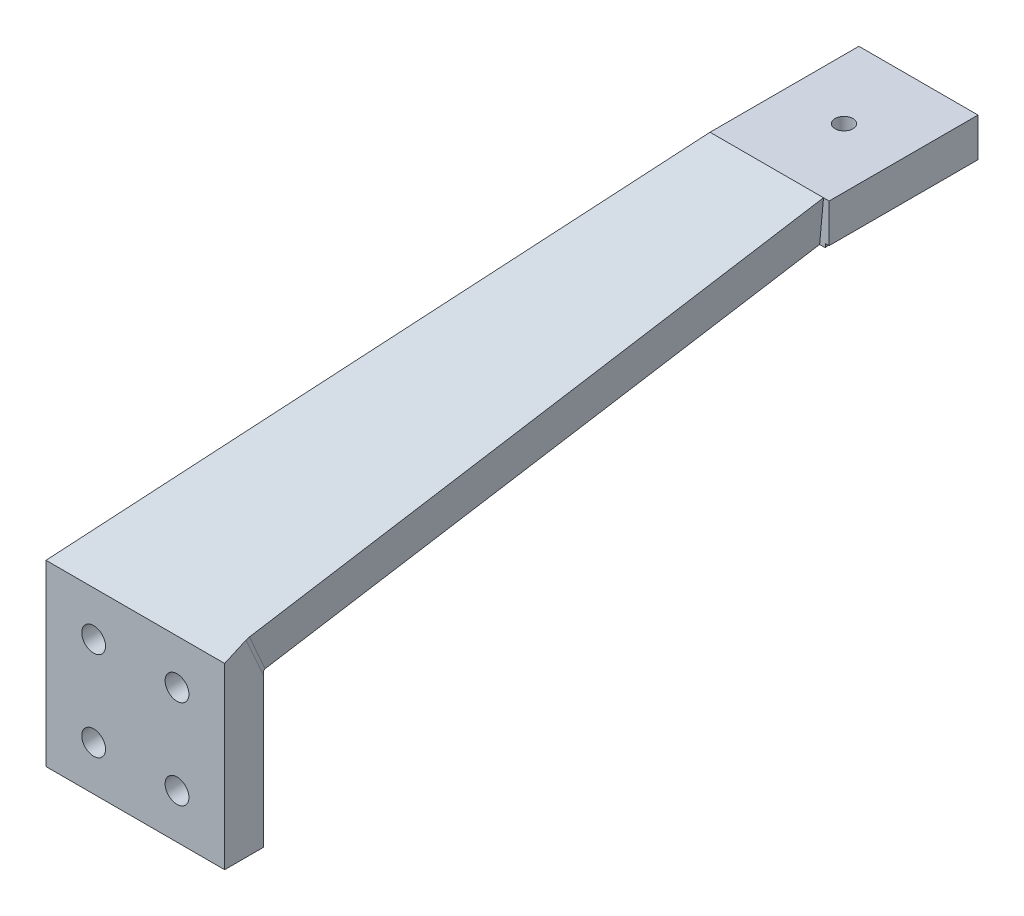
ISO-10303-21;
HEADER;
FILE_DESCRIPTION(('STEP AP214'),'2;1');
FILE_NAME('part.step','',(''),(''),'','','');
FILE_SCHEMA(('AUTOMOTIVE_DESIGN { 1 0 10303 214 1 1 1 1 }'));
ENDSEC;
DATA;
#1=APPLICATION_CONTEXT('core data for automotive mechanical design processes');
#2=APPLICATION_PROTOCOL_DEFINITION('international standard','automotive_design',2000,#1);
#3=PRODUCT_CONTEXT('',#1,'mechanical');
#4=PRODUCT('Part','Part','',(#3));
#5=PRODUCT_RELATED_PRODUCT_CATEGORY('part','',(#4));
#6=PRODUCT_DEFINITION_FORMATION('','',#4);
#7=PRODUCT_DEFINITION_CONTEXT('part definition',#1,'design');
#8=PRODUCT_DEFINITION('design','',#6,#7);
#9=PRODUCT_DEFINITION_SHAPE('','',#8);
#10=(LENGTH_UNIT() NAMED_UNIT(*) SI_UNIT(.MILLI.,.METRE.));
#11=(NAMED_UNIT(*) PLANE_ANGLE_UNIT() SI_UNIT($,.RADIAN.));
#12=(NAMED_UNIT(*) SI_UNIT($,.STERADIAN.) SOLID_ANGLE_UNIT());
#13=UNCERTAINTY_MEASURE_WITH_UNIT(LENGTH_MEASURE(1.E-05),#10,'distance_accuracy_value','');
#14=(GEOMETRIC_REPRESENTATION_CONTEXT(3) GLOBAL_UNCERTAINTY_ASSIGNED_CONTEXT((#13)) GLOBAL_UNIT_ASSIGNED_CONTEXT((#10,
#11,#12)) REPRESENTATION_CONTEXT('',''));
#15=CARTESIAN_POINT('',(0.,0.,0.));
#16=DIRECTION('',(0.,0.,1.));
#17=DIRECTION('',(1.,0.,0.));
#18=AXIS2_PLACEMENT_3D('',#15,#16,#17);
#19=CARTESIAN_POINT('',(0.,17.9730190830159,8.04926621509302));
#20=DIRECTION('',(0.,-0.912653403131036,-0.408734346187519));
#21=DIRECTION('',(0.,0.408734346187519,-0.912653403131036));
#22=AXIS2_PLACEMENT_3D('',#19,#20,#21);
#23=PLANE('',#22);
#24=DIRECTION('',(-0.218549869857348,-0.398853512489659,0.890590719668691));
#25=VECTOR('',#24,1.);
#26=CARTESIAN_POINT('',(68.4987026552374,91.8380375251541,-156.882213320092));
#27=LINE('',#26,#25);
#28=CARTESIAN_POINT('',(66.8098159509203,88.7558192897754,-150.));
#29=VERTEX_POINT('',#28);
#30=CARTESIAN_POINT('',(30.1450958659663,21.8427051347343,-0.591265653812539));
#31=VERTEX_POINT('',#30);
#32=EDGE_CURVE('E403',#29,#31,#27,.T.);
#33=ORIENTED_EDGE('',*,*,#32,.T.);
#34=DIRECTION('',(-1.,0.,0.));
#35=VECTOR('',#34,1.);
#36=CARTESIAN_POINT('',(-27.1706306136581,21.8427051347343,-0.59126565381248));
#37=LINE('',#36,#35);
#38=CARTESIAN_POINT('',(-26.9529868147087,21.8427051347343,-0.591265653812485));
#39=VERTEX_POINT('',#38);
#40=EDGE_CURVE('E286',#31,#39,#37,.T.);
#41=ORIENTED_EDGE('',*,*,#40,.T.);
#42=DIRECTION('',(0.318455906175822,0.387454685847249,-0.865138545110981));
#43=VECTOR('',#42,1.);
#44=CARTESIAN_POINT('',(-30.,18.1355057592965,7.68645349956226));
#45=LINE('',#44,#43);
#46=CARTESIAN_POINT('',(30.,91.1355057592965,-155.313546500438));
#47=VERTEX_POINT('',#46);
#48=EDGE_CURVE('E197',#39,#47,#45,.T.);
#49=ORIENTED_EDGE('',*,*,#48,.T.);
#50=DIRECTION('',(0.,0.408734346187519,-0.912653403131036));
#51=VECTOR('',#50,1.);
#52=CARTESIAN_POINT('',(30.,17.9730190830159,8.04926621509302));
#53=LINE('',#52,#51);
#54=CARTESIAN_POINT('',(30.,90.,-152.778102133789));
#55=VERTEX_POINT('',#54);
#56=EDGE_CURVE('E194',#55,#47,#53,.T.);
#57=ORIENTED_EDGE('',*,*,#56,.F.);
#58=DIRECTION('',(-1.,0.,0.));
#59=VECTOR('',#58,1.);
#60=CARTESIAN_POINT('',(0.,90.,-152.778102133789));
#61=LINE('',#60,#59);
#62=CARTESIAN_POINT('',(69.3778050633992,90.,-152.778102133789));
#63=VERTEX_POINT('',#62);
#64=EDGE_CURVE('E185',#63,#55,#61,.T.);
#65=ORIENTED_EDGE('',*,*,#64,.F.);
#66=DIRECTION('',(-0.218549869857348,-0.398853512489659,0.890590719668691));
#67=VECTOR('',#66,1.);
#68=CARTESIAN_POINT('',(70.,91.1355057592965,-155.313546500438));
#69=LINE('',#68,#67);
#70=CARTESIAN_POINT('',(68.6960622084816,88.7558192897754,-150.));
#71=VERTEX_POINT('',#70);
#72=EDGE_CURVE('E178',#63,#71,#69,.T.);
#73=ORIENTED_EDGE('',*,*,#72,.T.);
#74=DIRECTION('',(-1.,0.,0.));
#75=VECTOR('',#74,1.);
#76=CARTESIAN_POINT('',(68.4987026552374,88.7558192897754,-150.));
#77=LINE('',#76,#75);
#78=EDGE_CURVE('E161',#71,#29,#77,.T.);
#79=ORIENTED_EDGE('',*,*,#78,.T.);
#80=EDGE_LOOP('',(#33,#41,#49,#57,#65,#73,#79));
#81=FACE_BOUND('',#80,.T.);
#82=ADVANCED_FACE('F40',(#81),#23,.T.);
#83=CARTESIAN_POINT('',(0.,29.8375133237194,13.3628127155308));
#84=DIRECTION('',(0.,-0.912653403131036,-0.408734346187519));
#85=DIRECTION('',(0.,0.408734346187519,-0.912653403131036));
#86=AXIS2_PLACEMENT_3D('',#83,#84,#85);
#87=PLANE('',#86);
#88=DIRECTION('',(-0.218549869857348,-0.398853512489659,0.890590719668691));
#89=VECTOR('',#88,1.);
#90=CARTESIAN_POINT('',(68.4987026552374,103.702531765858,-151.568666819654));
#91=LINE('',#90,#89);
#92=CARTESIAN_POINT('',(68.1137537424387,103.,-150.));
#93=VERTEX_POINT('',#92);
#94=CARTESIAN_POINT('',(30.120871096227,33.6629891706636,4.82099678331274));
#95=VERTEX_POINT('',#94);
#96=EDGE_CURVE('E400',#93,#95,#91,.T.);
#97=ORIENTED_EDGE('',*,*,#96,.F.);
#98=DIRECTION('',(1.,0.,0.));
#99=VECTOR('',#98,1.);
#100=CARTESIAN_POINT('',(30.,103.,-150.));
#101=LINE('',#100,#99);
#102=CARTESIAN_POINT('',(30.,103.,-150.));
#103=VERTEX_POINT('',#102);
#104=EDGE_CURVE('E191',#103,#93,#101,.T.);
#105=ORIENTED_EDGE('',*,*,#104,.F.);
#106=DIRECTION('',(0.318455906175822,0.387454685847249,-0.865138545110981));
#107=VECTOR('',#106,1.);
#108=CARTESIAN_POINT('',(-30.,30.,13.));
#109=LINE('',#108,#107);
#110=CARTESIAN_POINT('',(-30.,30.,13.));
#111=VERTEX_POINT('',#110);
#112=EDGE_CURVE('E187',#111,#103,#109,.T.);
#113=ORIENTED_EDGE('',*,*,#112,.F.);
#114=DIRECTION('',(-1.,0.,0.));
#115=VECTOR('',#114,1.);
#116=CARTESIAN_POINT('',(-30.,30.,13.));
#117=LINE('',#116,#115);
#118=CARTESIAN_POINT('',(30.,30.,13.));
#119=VERTEX_POINT('',#118);
#120=EDGE_CURVE('E241',#119,#111,#117,.T.);
#121=ORIENTED_EDGE('',*,*,#120,.F.);
#122=DIRECTION('',(0.,-0.408734346187519,0.912653403131036));
#123=VECTOR('',#122,1.);
#124=CARTESIAN_POINT('',(30.,30.,13.));
#125=LINE('',#124,#123);
#126=CARTESIAN_POINT('',(30.,33.2163449798361,5.81829819570857));
#127=VERTEX_POINT('',#126);
#128=EDGE_CURVE('E173',#127,#119,#125,.T.);
#129=ORIENTED_EDGE('',*,*,#128,.F.);
#130=CARTESIAN_POINT('',(35.,33.2163449798361,5.81829819570857));
#131=DIRECTION('',(0.,-0.912653403131036,-0.408734346187519));
#132=DIRECTION('',(0.,0.408734346187519,-0.912653403131036));
#133=AXIS2_PLACEMENT_3D('',#130,#131,#132);
#134=CIRCLE('',#133,5.);
#135=EDGE_CURVE('E284',#127,#95,#134,.T.);
#136=ORIENTED_EDGE('',*,*,#135,.T.);
#137=EDGE_LOOP('',(#97,#105,#113,#121,#129,#136));
#138=FACE_BOUND('',#137,.T.);
#139=ADVANCED_FACE('F307',(#138),#87,.F.);
#140=CARTESIAN_POINT('',(30.,-30.,13.));
#141=DIRECTION('',(-1.,0.,0.));
#142=DIRECTION('',(0.,0.,1.));
#143=AXIS2_PLACEMENT_3D('',#140,#141,#142);
#144=PLANE('',#143);
#145=DIRECTION('',(0.,1.,0.));
#146=VECTOR('',#145,1.);
#147=CARTESIAN_POINT('',(30.,-30.,0.));
#148=LINE('',#147,#146);
#149=CARTESIAN_POINT('',(30.,-30.,0.));
#150=VERTEX_POINT('',#149);
#151=CARTESIAN_POINT('',(30.,20.2248024332539,0.));
#152=VERTEX_POINT('',#151);
#153=EDGE_CURVE('E237',#150,#152,#148,.T.);
#154=ORIENTED_EDGE('',*,*,#153,.T.);
#155=DIRECTION('',(0.,-0.912653403131036,-0.408734346187519));
#156=VECTOR('',#155,1.);
#157=CARTESIAN_POINT('',(30.,33.2163449798361,5.81829819570857));
#158=LINE('',#157,#156);
#159=EDGE_CURVE('E280',#152,#127,#158,.F.);
#160=ORIENTED_EDGE('',*,*,#159,.T.);
#161=ORIENTED_EDGE('',*,*,#128,.T.);
#162=DIRECTION('',(0.,1.,0.));
#163=VECTOR('',#162,1.);
#164=CARTESIAN_POINT('',(30.,-30.,13.));
#165=LINE('',#164,#163);
#166=CARTESIAN_POINT('',(30.,-30.,13.));
#167=VERTEX_POINT('',#166);
#168=EDGE_CURVE('E238',#167,#119,#165,.T.);
#169=ORIENTED_EDGE('',*,*,#168,.F.);
#170=DIRECTION('',(0.,0.,-1.));
#171=VECTOR('',#170,1.);
#172=CARTESIAN_POINT('',(30.,-30.,13.));
#173=LINE('',#172,#171);
#174=EDGE_CURVE('E248',#167,#150,#173,.T.);
#175=ORIENTED_EDGE('',*,*,#174,.T.);
#176=EDGE_LOOP('',(#154,#160,#161,#169,#175));
#177=FACE_BOUND('',#176,.T.);
#178=ADVANCED_FACE('F303',(#177),#144,.F.);
#179=CARTESIAN_POINT('',(-30.,30.,13.));
#180=DIRECTION('',(0.,-1.,0.));
#181=DIRECTION('',(0.,0.,-1.));
#182=AXIS2_PLACEMENT_3D('',#179,#180,#181);
#183=PLANE('',#182);
#184=DIRECTION('',(-0.293133702933784,0.,0.956071457687305));
#185=VECTOR('',#184,1.);
#186=CARTESIAN_POINT('',(-30.,30.,13.));
#187=LINE('',#186,#185);
#188=CARTESIAN_POINT('',(-26.0141701674086,30.,0.));
#189=VERTEX_POINT('',#188);
#190=EDGE_CURVE('E210',#189,#111,#187,.T.);
#191=ORIENTED_EDGE('',*,*,#190,.F.);
#192=DIRECTION('',(-1.,0.,0.));
#193=VECTOR('',#192,1.);
#194=CARTESIAN_POINT('',(-30.,30.,0.));
#195=LINE('',#194,#193);
#196=CARTESIAN_POINT('',(-30.,30.,0.));
#197=VERTEX_POINT('',#196);
#198=EDGE_CURVE('E251',#189,#197,#195,.T.);
#199=ORIENTED_EDGE('',*,*,#198,.T.);
#200=DIRECTION('',(0.,0.,-1.));
#201=VECTOR('',#200,1.);
#202=CARTESIAN_POINT('',(-30.,30.,13.));
#203=LINE('',#202,#201);
#204=EDGE_CURVE('E261',#111,#197,#203,.T.);
#205=ORIENTED_EDGE('',*,*,#204,.F.);
#206=EDGE_LOOP('',(#191,#199,#205));
#207=FACE_BOUND('',#206,.T.);
#208=ADVANCED_FACE('F306',(#207),#183,.F.);
#209=CARTESIAN_POINT('',(0.,0.,0.));
#210=DIRECTION('',(0.,0.,-1.));
#211=DIRECTION('',(-1.,0.,0.));
#212=AXIS2_PLACEMENT_3D('',#209,#210,#211);
#213=PLANE('',#212);
#214=CARTESIAN_POINT('',(14.,15.,0.));
#215=DIRECTION('',(0.,0.,-1.));
#216=DIRECTION('',(-1.,0.,0.));
#217=AXIS2_PLACEMENT_3D('',#214,#215,#216);
#218=CIRCLE('',#217,4.);
#219=CARTESIAN_POINT('',(10.,15.,0.));
#220=VERTEX_POINT('',#219);
#221=EDGE_CURVE('E216',#220,#220,#218,.T.);
#222=ORIENTED_EDGE('',*,*,#221,.F.);
#223=EDGE_LOOP('',(#222));
#224=FACE_BOUND('',#223,.T.);
#225=CARTESIAN_POINT('',(-14.,15.,0.));
#226=DIRECTION('',(0.,0.,-1.));
#227=DIRECTION('',(-1.,0.,0.));
#228=AXIS2_PLACEMENT_3D('',#225,#226,#227);
#229=CIRCLE('',#228,4.);
#230=CARTESIAN_POINT('',(-18.,15.,0.));
#231=VERTEX_POINT('',#230);
#232=EDGE_CURVE('E222',#231,#231,#229,.T.);
#233=ORIENTED_EDGE('',*,*,#232,.F.);
#234=EDGE_LOOP('',(#233));
#235=FACE_BOUND('',#234,.T.);
#236=CARTESIAN_POINT('',(-14.,-15.,0.));
#237=DIRECTION('',(0.,0.,-1.));
#238=DIRECTION('',(-1.,0.,0.));
#239=AXIS2_PLACEMENT_3D('',#236,#237,#238);
#240=CIRCLE('',#239,4.);
#241=CARTESIAN_POINT('',(-18.,-15.,0.));
#242=VERTEX_POINT('',#241);
#243=EDGE_CURVE('E228',#242,#242,#240,.T.);
#244=ORIENTED_EDGE('',*,*,#243,.F.);
#245=EDGE_LOOP('',(#244));
#246=FACE_BOUND('',#245,.T.);
#247=CARTESIAN_POINT('',(14.,-15.,0.));
#248=DIRECTION('',(0.,0.,-1.));
#249=DIRECTION('',(-1.,0.,0.));
#250=AXIS2_PLACEMENT_3D('',#247,#248,#249);
#251=CIRCLE('',#250,4.);
#252=CARTESIAN_POINT('',(10.,-15.,0.));
#253=VERTEX_POINT('',#252);
#254=EDGE_CURVE('E234',#253,#253,#251,.T.);
#255=ORIENTED_EDGE('',*,*,#254,.F.);
#256=EDGE_LOOP('',(#255));
#257=FACE_BOUND('',#256,.T.);
#258=DIRECTION('',(-0.136036207086398,-0.990703866128293,0.));
#259=VECTOR('',#258,1.);
#260=CARTESIAN_POINT('',(-29.5759037346391,4.06114672887703,0.));
#261=LINE('',#260,#259);
#262=CARTESIAN_POINT('',(-27.2595891095234,20.9300517316033,0.));
#263=VERTEX_POINT('',#262);
#264=EDGE_CURVE('E64',#189,#263,#261,.T.);
#265=ORIENTED_EDGE('',*,*,#264,.T.);
#266=DIRECTION('',(-1.,0.,0.));
#267=VECTOR('',#266,1.);
#268=CARTESIAN_POINT('',(30.0306816245906,20.9300517316033,0.));
#269=LINE('',#268,#267);
#270=CARTESIAN_POINT('',(30.0083162763706,20.9300517316033,0.));
#271=VERTEX_POINT('',#270);
#272=EDGE_CURVE('E289',#263,#271,#269,.F.);
#273=ORIENTED_EDGE('',*,*,#272,.T.);
#274=CARTESIAN_POINT('',(35.,20.2248024332539,0.));
#275=DIRECTION('',(0.,0.,-1.));
#276=DIRECTION('',(0.,1.,0.));
#277=AXIS2_PLACEMENT_3D('',#274,#275,#276);
#278=ELLIPSE('',#277,12.232884382332,5.);
#279=EDGE_CURVE('E282',#271,#152,#278,.F.);
#280=ORIENTED_EDGE('',*,*,#279,.T.);
#281=ORIENTED_EDGE('',*,*,#153,.F.);
#282=DIRECTION('',(1.,0.,0.));
#283=VECTOR('',#282,1.);
#284=CARTESIAN_POINT('',(-30.,-30.,0.));
#285=LINE('',#284,#283);
#286=CARTESIAN_POINT('',(-30.,-30.,0.));
#287=VERTEX_POINT('',#286);
#288=EDGE_CURVE('E242',#287,#150,#285,.T.);
#289=ORIENTED_EDGE('',*,*,#288,.F.);
#290=DIRECTION('',(0.,-1.,0.));
#291=VECTOR('',#290,1.);
#292=CARTESIAN_POINT('',(-30.,-30.,0.));
#293=LINE('',#292,#291);
#294=EDGE_CURVE('E253',#197,#287,#293,.T.);
#295=ORIENTED_EDGE('',*,*,#294,.F.);
#296=ORIENTED_EDGE('',*,*,#198,.F.);
#297=EDGE_LOOP('',(#265,#273,#280,#281,#289,#295,#296));
#298=FACE_BOUND('',#297,.T.);
#299=ADVANCED_FACE('F311',(#224,#235,#246,#257,#298),#213,.T.);
#300=CARTESIAN_POINT('',(-14.,15.,13.));
#301=DIRECTION('',(0.,0.,1.));
#302=DIRECTION('',(1.,0.,0.));
#303=AXIS2_PLACEMENT_3D('',#300,#301,#302);
#304=CYLINDRICAL_SURFACE('',#303,4.);
#305=ORIENTED_EDGE('',*,*,#232,.T.);
#306=EDGE_LOOP('',(#305));
#307=FACE_BOUND('',#306,.T.);
#308=CARTESIAN_POINT('',(-14.,15.,13.));
#309=DIRECTION('',(0.,0.,1.));
#310=DIRECTION('',(1.,0.,0.));
#311=AXIS2_PLACEMENT_3D('',#308,#309,#310);
#312=CIRCLE('',#311,4.);
#313=CARTESIAN_POINT('',(-10.,15.,13.));
#314=VERTEX_POINT('',#313);
#315=EDGE_CURVE('E219',#314,#314,#312,.T.);
#316=ORIENTED_EDGE('',*,*,#315,.T.);
#317=EDGE_LOOP('',(#316));
#318=FACE_BOUND('',#317,.T.);
#319=CARTESIAN_POINT('',(-14.,15.,6.28220858895705));
#320=DIRECTION('',(0.,0.408734346187519,-0.912653403131036));
#321=DIRECTION('',(0.,0.912653403131036,0.408734346187519));
#322=AXIS2_PLACEMENT_3D('',#319,#320,#321);
#323=ELLIPSE('',#322,4.38282483391528,4.);
#324=CARTESIAN_POINT('',(-11.5163326242393,18.1355057592965,7.68645349956226));
#325=VERTEX_POINT('',#324);
#326=CARTESIAN_POINT('',(-16.4836673757607,18.1355057592965,7.68645349956226));
#327=VERTEX_POINT('',#326);
#328=EDGE_CURVE('E207',#325,#327,#323,.F.);
#329=ORIENTED_EDGE('',*,*,#328,.F.);
#330=CARTESIAN_POINT('',(-14.,15.,14.6876512908683));
#331=DIRECTION('',(0.,-0.912653403131036,-0.408734346187519));
#332=DIRECTION('',(0.,-0.408734346187519,0.912653403131036));
#333=AXIS2_PLACEMENT_3D('',#330,#331,#332);
#334=ELLIPSE('',#333,9.78630750586562,4.);
#335=EDGE_CURVE('E204',#325,#327,#334,.F.);
#336=ORIENTED_EDGE('',*,*,#335,.T.);
#337=EDGE_LOOP('',(#329,#336));
#338=FACE_BOUND('',#337,.T.);
#339=ADVANCED_FACE('F325',(#307,#318,#338),#304,.F.);
#340=CARTESIAN_POINT('',(14.,15.,13.));
#341=DIRECTION('',(0.,0.,1.));
#342=DIRECTION('',(1.,0.,0.));
#343=AXIS2_PLACEMENT_3D('',#340,#341,#342);
#344=CYLINDRICAL_SURFACE('',#343,4.);
#345=ORIENTED_EDGE('',*,*,#221,.T.);
#346=EDGE_LOOP('',(#345));
#347=FACE_BOUND('',#346,.T.);
#348=CARTESIAN_POINT('',(14.,15.,13.));
#349=DIRECTION('',(0.,0.,1.));
#350=DIRECTION('',(1.,0.,0.));
#351=AXIS2_PLACEMENT_3D('',#348,#349,#350);
#352=CIRCLE('',#351,4.);
#353=CARTESIAN_POINT('',(18.,15.,13.));
#354=VERTEX_POINT('',#353);
#355=EDGE_CURVE('E213',#354,#354,#352,.T.);
#356=ORIENTED_EDGE('',*,*,#355,.T.);
#357=EDGE_LOOP('',(#356));
#358=FACE_BOUND('',#357,.T.);
#359=CARTESIAN_POINT('',(14.,15.,6.28220858895705));
#360=DIRECTION('',(0.,0.408734346187519,-0.912653403131036));
#361=DIRECTION('',(0.,0.912653403131036,0.408734346187519));
#362=AXIS2_PLACEMENT_3D('',#359,#360,#361);
#363=ELLIPSE('',#362,4.38282483391528,4.);
#364=CARTESIAN_POINT('',(16.4836673757607,18.1355057592965,7.68645349956226));
#365=VERTEX_POINT('',#364);
#366=CARTESIAN_POINT('',(11.5163326242393,18.1355057592965,7.68645349956226));
#367=VERTEX_POINT('',#366);
#368=EDGE_CURVE('E267',#365,#367,#363,.F.);
#369=ORIENTED_EDGE('',*,*,#368,.F.);
#370=CARTESIAN_POINT('',(14.,15.,14.6876512908683));
#371=DIRECTION('',(0.,-0.912653403131036,-0.408734346187519));
#372=DIRECTION('',(0.,-0.408734346187519,0.912653403131036));
#373=AXIS2_PLACEMENT_3D('',#370,#371,#372);
#374=ELLIPSE('',#373,9.78630750586562,4.);
#375=EDGE_CURVE('E264',#365,#367,#374,.F.);
#376=ORIENTED_EDGE('',*,*,#375,.T.);
#377=EDGE_LOOP('',(#369,#376));
#378=FACE_BOUND('',#377,.T.);
#379=ADVANCED_FACE('F329',(#347,#358,#378),#344,.F.);
#380=CARTESIAN_POINT('',(0.,0.,13.));
#381=DIRECTION('',(0.,0.,-1.));
#382=DIRECTION('',(-1.,0.,0.));
#383=AXIS2_PLACEMENT_3D('',#380,#381,#382);
#384=PLANE('',#383);
#385=ORIENTED_EDGE('',*,*,#355,.F.);
#386=EDGE_LOOP('',(#385));
#387=FACE_BOUND('',#386,.T.);
#388=ORIENTED_EDGE('',*,*,#168,.T.);
#389=ORIENTED_EDGE('',*,*,#120,.T.);
#390=DIRECTION('',(0.,-1.,0.));
#391=VECTOR('',#390,1.);
#392=CARTESIAN_POINT('',(-30.,-30.,13.));
#393=LINE('',#392,#391);
#394=CARTESIAN_POINT('',(-30.,-30.,13.));
#395=VERTEX_POINT('',#394);
#396=EDGE_CURVE('E244',#111,#395,#393,.T.);
#397=ORIENTED_EDGE('',*,*,#396,.T.);
#398=DIRECTION('',(1.,0.,0.));
#399=VECTOR('',#398,1.);
#400=CARTESIAN_POINT('',(-30.,-30.,13.));
#401=LINE('',#400,#399);
#402=EDGE_CURVE('E246',#395,#167,#401,.T.);
#403=ORIENTED_EDGE('',*,*,#402,.T.);
#404=EDGE_LOOP('',(#388,#389,#397,#403));
#405=FACE_BOUND('',#404,.T.);
#406=CARTESIAN_POINT('',(14.,-15.,13.));
#407=DIRECTION('',(0.,0.,1.));
#408=DIRECTION('',(1.,0.,0.));
#409=AXIS2_PLACEMENT_3D('',#406,#407,#408);
#410=CIRCLE('',#409,4.);
#411=CARTESIAN_POINT('',(18.,-15.,13.));
#412=VERTEX_POINT('',#411);
#413=EDGE_CURVE('E231',#412,#412,#410,.T.);
#414=ORIENTED_EDGE('',*,*,#413,.F.);
#415=EDGE_LOOP('',(#414));
#416=FACE_BOUND('',#415,.T.);
#417=CARTESIAN_POINT('',(-14.,-15.,13.));
#418=DIRECTION('',(0.,0.,1.));
#419=DIRECTION('',(1.,0.,0.));
#420=AXIS2_PLACEMENT_3D('',#417,#418,#419);
#421=CIRCLE('',#420,4.);
#422=CARTESIAN_POINT('',(-10.,-15.,13.));
#423=VERTEX_POINT('',#422);
#424=EDGE_CURVE('E225',#423,#423,#421,.T.);
#425=ORIENTED_EDGE('',*,*,#424,.F.);
#426=EDGE_LOOP('',(#425));
#427=FACE_BOUND('',#426,.T.);
#428=ORIENTED_EDGE('',*,*,#315,.F.);
#429=EDGE_LOOP('',(#428));
#430=FACE_BOUND('',#429,.T.);
#431=ADVANCED_FACE('F317',(#387,#405,#416,#427,#430),#384,.F.);
#432=CARTESIAN_POINT('',(-30.,-30.,13.));
#433=DIRECTION('',(1.,0.,0.));
#434=DIRECTION('',(0.,0.,-1.));
#435=AXIS2_PLACEMENT_3D('',#432,#433,#434);
#436=PLANE('',#435);
#437=ORIENTED_EDGE('',*,*,#294,.T.);
#438=DIRECTION('',(0.,0.,-1.));
#439=VECTOR('',#438,1.);
#440=CARTESIAN_POINT('',(-30.,-30.,13.));
#441=LINE('',#440,#439);
#442=EDGE_CURVE('E258',#395,#287,#441,.T.);
#443=ORIENTED_EDGE('',*,*,#442,.F.);
#444=ORIENTED_EDGE('',*,*,#396,.F.);
#445=ORIENTED_EDGE('',*,*,#204,.T.);
#446=EDGE_LOOP('',(#437,#443,#444,#445));
#447=FACE_BOUND('',#446,.T.);
#448=ADVANCED_FACE('F313',(#447),#436,.F.);
#449=CARTESIAN_POINT('',(-30.,-30.,13.));
#450=DIRECTION('',(0.,1.,0.));
#451=DIRECTION('',(0.,0.,1.));
#452=AXIS2_PLACEMENT_3D('',#449,#450,#451);
#453=PLANE('',#452);
#454=ORIENTED_EDGE('',*,*,#288,.T.);
#455=ORIENTED_EDGE('',*,*,#174,.F.);
#456=ORIENTED_EDGE('',*,*,#402,.F.);
#457=ORIENTED_EDGE('',*,*,#442,.T.);
#458=EDGE_LOOP('',(#454,#455,#456,#457));
#459=FACE_BOUND('',#458,.T.);
#460=ADVANCED_FACE('F316',(#459),#453,.F.);
#461=CARTESIAN_POINT('',(14.,-15.,13.));
#462=DIRECTION('',(0.,0.,1.));
#463=DIRECTION('',(1.,0.,0.));
#464=AXIS2_PLACEMENT_3D('',#461,#462,#463);
#465=CYLINDRICAL_SURFACE('',#464,4.);
#466=ORIENTED_EDGE('',*,*,#413,.T.);
#467=EDGE_LOOP('',(#466));
#468=FACE_BOUND('',#467,.T.);
#469=ORIENTED_EDGE('',*,*,#254,.T.);
#470=EDGE_LOOP('',(#469));
#471=FACE_BOUND('',#470,.T.);
#472=ADVANCED_FACE('F321',(#468,#471),#465,.F.);
#473=CARTESIAN_POINT('',(-14.,-15.,13.));
#474=DIRECTION('',(0.,0.,1.));
#475=DIRECTION('',(1.,0.,0.));
#476=AXIS2_PLACEMENT_3D('',#473,#474,#475);
#477=CYLINDRICAL_SURFACE('',#476,4.);
#478=ORIENTED_EDGE('',*,*,#424,.T.);
#479=EDGE_LOOP('',(#478));
#480=FACE_BOUND('',#479,.T.);
#481=ORIENTED_EDGE('',*,*,#243,.T.);
#482=EDGE_LOOP('',(#481));
#483=FACE_BOUND('',#482,.T.);
#484=ADVANCED_FACE('F333',(#480,#483),#477,.F.);
#485=ORIENTED_EDGE('',*,*,#375,.F.);
#486=DIRECTION('',(-1.,0.,0.));
#487=VECTOR('',#486,1.);
#488=CARTESIAN_POINT('',(30.,18.1355057592965,7.68645349956226));
#489=LINE('',#488,#487);
#490=EDGE_CURVE('E189',#365,#367,#489,.T.);
#491=ORIENTED_EDGE('',*,*,#490,.T.);
#492=EDGE_LOOP('',(#485,#491));
#493=FACE_BOUND('',#492,.T.);
#494=ADVANCED_FACE('F337',(#493),#23,.T.);
#495=CARTESIAN_POINT('',(30.,18.1355057592965,7.68645349956226));
#496=DIRECTION('',(0.,0.408734346187519,-0.912653403131036));
#497=DIRECTION('',(0.,0.912653403131036,0.408734346187519));
#498=AXIS2_PLACEMENT_3D('',#495,#496,#497);
#499=PLANE('',#498);
#500=ORIENTED_EDGE('',*,*,#490,.F.);
#501=ORIENTED_EDGE('',*,*,#368,.T.);
#502=EDGE_LOOP('',(#500,#501));
#503=FACE_BOUND('',#502,.T.);
#504=ADVANCED_FACE('F353',(#503),#499,.F.);
#505=ORIENTED_EDGE('',*,*,#335,.F.);
#506=EDGE_CURVE('E186',#325,#327,#489,.T.);
#507=ORIENTED_EDGE('',*,*,#506,.T.);
#508=EDGE_LOOP('',(#505,#507));
#509=FACE_BOUND('',#508,.T.);
#510=ADVANCED_FACE('F351',(#509),#23,.T.);
#511=ORIENTED_EDGE('',*,*,#506,.F.);
#512=ORIENTED_EDGE('',*,*,#328,.T.);
#513=EDGE_LOOP('',(#511,#512));
#514=FACE_BOUND('',#513,.T.);
#515=ADVANCED_FACE('F348',(#514),#499,.F.);
#516=CARTESIAN_POINT('',(-30.,18.1355057592965,7.68645349956226));
#517=DIRECTION('',(0.947937675072437,-0.130163866600328,0.290639866518542));
#518=DIRECTION('',(0.293133702933784,0.,-0.956071457687305));
#519=AXIS2_PLACEMENT_3D('',#516,#517,#518);
#520=PLANE('',#519);
#521=ORIENTED_EDGE('',*,*,#264,.F.);
#522=ORIENTED_EDGE('',*,*,#190,.T.);
#523=ORIENTED_EDGE('',*,*,#112,.T.);
#524=DIRECTION('',(0.,0.912653403131036,0.408734346187519));
#525=VECTOR('',#524,1.);
#526=CARTESIAN_POINT('',(30.,91.1355057592965,-155.313546500438));
#527=LINE('',#526,#525);
#528=EDGE_CURVE('E199',#47,#103,#527,.T.);
#529=ORIENTED_EDGE('',*,*,#528,.F.);
#530=ORIENTED_EDGE('',*,*,#48,.F.);
#531=CARTESIAN_POINT('',(-26.9529868147087,20.9300517316033,-1.));
#532=DIRECTION('',(0.947937675072437,-0.130163866600328,0.290639866518542));
#533=DIRECTION('',(0.318455906175822,0.387454685847249,-0.865138545110981));
#534=AXIS2_PLACEMENT_3D('',#531,#532,#533);
#535=ELLIPSE('',#534,1.05492167501791,1.);
#536=EDGE_CURVE('E291',#39,#263,#535,.T.);
#537=ORIENTED_EDGE('',*,*,#536,.T.);
#538=EDGE_LOOP('',(#521,#522,#523,#529,#530,#537));
#539=FACE_BOUND('',#538,.T.);
#540=ADVANCED_FACE('F347',(#539),#520,.F.);
#541=CARTESIAN_POINT('',(70.,91.1355057592965,-155.313546500438));
#542=DIRECTION('',(-0.975825780754606,0.0893288381655104,-0.199460282479153));
#543=DIRECTION('',(-0.200260887842488,0.,0.979742607423265));
#544=AXIS2_PLACEMENT_3D('',#541,#542,#543);
#545=PLANE('',#544);
#546=DIRECTION('',(-0.200260887842488,0.,0.979742607423265));
#547=VECTOR('',#546,1.);
#548=CARTESIAN_POINT('',(69.9002224744223,90.,-155.333941179313));
#549=LINE('',#548,#547);
#550=CARTESIAN_POINT('',(68.8099567370995,90.,-150.));
#551=VERTEX_POINT('',#550);
#552=EDGE_CURVE('E180',#63,#551,#549,.T.);
#553=ORIENTED_EDGE('',*,*,#552,.T.);
#554=DIRECTION('',(-0.0911606278748249,-0.995836201353148,0.));
#555=VECTOR('',#554,1.);
#556=CARTESIAN_POINT('',(68.9899043143728,91.965742404062,-150.));
#557=LINE('',#556,#555);
#558=EDGE_CURVE('E165',#551,#71,#557,.T.);
#559=ORIENTED_EDGE('',*,*,#558,.T.);
#560=ORIENTED_EDGE('',*,*,#72,.F.);
#561=EDGE_LOOP('',(#553,#559,#560));
#562=FACE_BOUND('',#561,.T.);
#563=ADVANCED_FACE('F177',(#562),#545,.F.);
#564=CARTESIAN_POINT('',(0.,0.,-150.));
#565=DIRECTION('',(0.,0.,1.));
#566=DIRECTION('',(1.,0.,0.));
#567=AXIS2_PLACEMENT_3D('',#564,#565,#566);
#568=PLANE('',#567);
#569=DIRECTION('',(0.,-1.,0.));
#570=VECTOR('',#569,1.);
#571=CARTESIAN_POINT('',(70.,103.,-150.));
#572=LINE('',#571,#570);
#573=CARTESIAN_POINT('',(70.,103.,-150.));
#574=VERTEX_POINT('',#573);
#575=CARTESIAN_POINT('',(70.,90.,-150.));
#576=VERTEX_POINT('',#575);
#577=EDGE_CURVE('E276',#574,#576,#572,.T.);
#578=ORIENTED_EDGE('',*,*,#577,.F.);
#579=DIRECTION('',(1.,0.,0.));
#580=VECTOR('',#579,1.);
#581=CARTESIAN_POINT('',(70.3849489127987,103.,-150.));
#582=LINE('',#581,#580);
#583=EDGE_CURVE('E182',#93,#574,#582,.T.);
#584=ORIENTED_EDGE('',*,*,#583,.F.);
#585=DIRECTION('',(0.0911606278748259,0.995836201353148,0.));
#586=VECTOR('',#585,1.);
#587=CARTESIAN_POINT('',(68.180729341754,103.731639611972,-150.));
#588=LINE('',#587,#586);
#589=EDGE_CURVE('E168',#29,#93,#588,.T.);
#590=ORIENTED_EDGE('',*,*,#589,.F.);
#591=ORIENTED_EDGE('',*,*,#78,.F.);
#592=ORIENTED_EDGE('',*,*,#558,.F.);
#593=DIRECTION('',(1.,0.,0.));
#594=VECTOR('',#593,1.);
#595=CARTESIAN_POINT('',(30.,90.,-150.));
#596=LINE('',#595,#594);
#597=EDGE_CURVE('E274',#551,#576,#596,.T.);
#598=ORIENTED_EDGE('',*,*,#597,.T.);
#599=EDGE_LOOP('',(#578,#584,#590,#591,#592,#598));
#600=FACE_BOUND('',#599,.T.);
#601=ADVANCED_FACE('F164',(#600),#568,.T.);
#602=CARTESIAN_POINT('',(30.,103.,-200.));
#603=DIRECTION('',(-1.,0.,0.));
#604=DIRECTION('',(0.,0.,1.));
#605=AXIS2_PLACEMENT_3D('',#602,#603,#604);
#606=PLANE('',#605);
#607=DIRECTION('',(0.,0.,1.));
#608=VECTOR('',#607,1.);
#609=CARTESIAN_POINT('',(30.,90.,-200.));
#610=LINE('',#609,#608);
#611=CARTESIAN_POINT('',(30.,90.,-200.));
#612=VERTEX_POINT('',#611);
#613=EDGE_CURVE('E420',#612,#55,#610,.T.);
#614=ORIENTED_EDGE('',*,*,#613,.T.);
#615=ORIENTED_EDGE('',*,*,#56,.T.);
#616=ORIENTED_EDGE('',*,*,#528,.T.);
#617=DIRECTION('',(0.,0.,1.));
#618=VECTOR('',#617,1.);
#619=CARTESIAN_POINT('',(30.,103.,-200.));
#620=LINE('',#619,#618);
#621=CARTESIAN_POINT('',(30.,103.,-200.));
#622=VERTEX_POINT('',#621);
#623=EDGE_CURVE('E423',#622,#103,#620,.T.);
#624=ORIENTED_EDGE('',*,*,#623,.F.);
#625=DIRECTION('',(0.,-1.,0.));
#626=VECTOR('',#625,1.);
#627=CARTESIAN_POINT('',(30.,103.,-200.));
#628=LINE('',#627,#626);
#629=EDGE_CURVE('E410',#622,#612,#628,.T.);
#630=ORIENTED_EDGE('',*,*,#629,.T.);
#631=EDGE_LOOP('',(#614,#615,#616,#624,#630));
#632=FACE_BOUND('',#631,.T.);
#633=ADVANCED_FACE('F362',(#632),#606,.T.);
#634=CARTESIAN_POINT('',(30.,103.,-200.));
#635=DIRECTION('',(0.,-1.,0.));
#636=DIRECTION('',(0.,0.,-1.));
#637=AXIS2_PLACEMENT_3D('',#634,#635,#636);
#638=PLANE('',#637);
#639=CARTESIAN_POINT('',(50.,103.,-175.));
#640=DIRECTION('',(0.,1.,0.));
#641=DIRECTION('',(0.,0.,1.));
#642=AXIS2_PLACEMENT_3D('',#639,#640,#641);
#643=CIRCLE('',#642,2.99999999999998);
#644=CARTESIAN_POINT('',(50.,103.,-172.));
#645=VERTEX_POINT('',#644);
#646=EDGE_CURVE('E398',#645,#645,#643,.T.);
#647=ORIENTED_EDGE('',*,*,#646,.F.);
#648=EDGE_LOOP('',(#647));
#649=FACE_BOUND('',#648,.T.);
#650=ORIENTED_EDGE('',*,*,#104,.T.);
#651=ORIENTED_EDGE('',*,*,#583,.T.);
#652=DIRECTION('',(0.,0.,1.));
#653=VECTOR('',#652,1.);
#654=CARTESIAN_POINT('',(70.,103.,-200.));
#655=LINE('',#654,#653);
#656=CARTESIAN_POINT('',(70.,103.,-200.));
#657=VERTEX_POINT('',#656);
#658=EDGE_CURVE('E426',#657,#574,#655,.T.);
#659=ORIENTED_EDGE('',*,*,#658,.F.);
#660=DIRECTION('',(1.,0.,0.));
#661=VECTOR('',#660,1.);
#662=CARTESIAN_POINT('',(30.,103.,-200.));
#663=LINE('',#662,#661);
#664=EDGE_CURVE('E418',#622,#657,#663,.T.);
#665=ORIENTED_EDGE('',*,*,#664,.F.);
#666=ORIENTED_EDGE('',*,*,#623,.T.);
#667=EDGE_LOOP('',(#650,#651,#659,#665,#666));
#668=FACE_BOUND('',#667,.T.);
#669=ADVANCED_FACE('F365',(#649,#668),#638,.F.);
#670=CARTESIAN_POINT('',(70.,103.,-200.));
#671=DIRECTION('',(-1.,0.,0.));
#672=DIRECTION('',(0.,0.,1.));
#673=AXIS2_PLACEMENT_3D('',#670,#671,#672);
#674=PLANE('',#673);
#675=ORIENTED_EDGE('',*,*,#658,.T.);
#676=ORIENTED_EDGE('',*,*,#577,.T.);
#677=DIRECTION('',(0.,0.,1.));
#678=VECTOR('',#677,1.);
#679=CARTESIAN_POINT('',(70.,90.,-200.));
#680=LINE('',#679,#678);
#681=CARTESIAN_POINT('',(70.,90.,-200.));
#682=VERTEX_POINT('',#681);
#683=EDGE_CURVE('E429',#682,#576,#680,.T.);
#684=ORIENTED_EDGE('',*,*,#683,.F.);
#685=DIRECTION('',(0.,-1.,0.));
#686=VECTOR('',#685,1.);
#687=CARTESIAN_POINT('',(70.,103.,-200.));
#688=LINE('',#687,#686);
#689=EDGE_CURVE('E416',#657,#682,#688,.T.);
#690=ORIENTED_EDGE('',*,*,#689,.F.);
#691=EDGE_LOOP('',(#675,#676,#684,#690));
#692=FACE_BOUND('',#691,.T.);
#693=ADVANCED_FACE('F371',(#692),#674,.F.);
#694=CARTESIAN_POINT('',(30.,90.,-200.));
#695=DIRECTION('',(0.,-1.,0.));
#696=DIRECTION('',(0.,0.,-1.));
#697=AXIS2_PLACEMENT_3D('',#694,#695,#696);
#698=PLANE('',#697);
#699=CARTESIAN_POINT('',(50.,90.,-175.));
#700=DIRECTION('',(0.,-1.,0.));
#701=DIRECTION('',(0.,0.,-1.));
#702=AXIS2_PLACEMENT_3D('',#699,#700,#701);
#703=CIRCLE('',#702,2.99999999999998);
#704=CARTESIAN_POINT('',(50.,90.,-178.));
#705=VERTEX_POINT('',#704);
#706=EDGE_CURVE('E45',#705,#705,#703,.T.);
#707=ORIENTED_EDGE('',*,*,#706,.F.);
#708=EDGE_LOOP('',(#707));
#709=FACE_BOUND('',#708,.T.);
#710=ORIENTED_EDGE('',*,*,#552,.F.);
#711=ORIENTED_EDGE('',*,*,#64,.T.);
#712=ORIENTED_EDGE('',*,*,#613,.F.);
#713=DIRECTION('',(1.,0.,0.));
#714=VECTOR('',#713,1.);
#715=CARTESIAN_POINT('',(30.,90.,-200.));
#716=LINE('',#715,#714);
#717=EDGE_CURVE('E413',#612,#682,#716,.T.);
#718=ORIENTED_EDGE('',*,*,#717,.T.);
#719=ORIENTED_EDGE('',*,*,#683,.T.);
#720=ORIENTED_EDGE('',*,*,#597,.F.);
#721=EDGE_LOOP('',(#710,#711,#712,#718,#719,#720));
#722=FACE_BOUND('',#721,.T.);
#723=ADVANCED_FACE('F367',(#709,#722),#698,.T.);
#724=CARTESIAN_POINT('',(0.,0.,-200.));
#725=DIRECTION('',(0.,0.,1.));
#726=DIRECTION('',(1.,0.,0.));
#727=AXIS2_PLACEMENT_3D('',#724,#725,#726);
#728=PLANE('',#727);
#729=ORIENTED_EDGE('',*,*,#629,.F.);
#730=ORIENTED_EDGE('',*,*,#664,.T.);
#731=ORIENTED_EDGE('',*,*,#689,.T.);
#732=ORIENTED_EDGE('',*,*,#717,.F.);
#733=EDGE_LOOP('',(#729,#730,#731,#732));
#734=FACE_BOUND('',#733,.T.);
#735=ADVANCED_FACE('F370',(#734),#728,.F.);
#736=CARTESIAN_POINT('',(68.4987026552374,103.702531765858,-151.568666819654));
#737=DIRECTION('',(-0.975825780754606,0.0893288381655105,-0.199460282479153));
#738=DIRECTION('',(-0.200260887842488,0.,0.979742607423265));
#739=AXIS2_PLACEMENT_3D('',#736,#737,#738);
#740=PLANE('',#739);
#741=ORIENTED_EDGE('',*,*,#96,.T.);
#742=DIRECTION('',(0.,-0.912653403131036,-0.408734346187519));
#743=VECTOR('',#742,1.);
#744=CARTESIAN_POINT('',(30.120871096227,21.7984949299602,-0.492549717124946));
#745=LINE('',#744,#743);
#746=CARTESIAN_POINT('',(30.120871096227,21.7931404842244,-0.494947720429915));
#747=VERTEX_POINT('',#746);
#748=EDGE_CURVE('E56',#95,#747,#745,.T.);
#749=ORIENTED_EDGE('',*,*,#748,.T.);
#750=CARTESIAN_POINT('',(30.1450958659662,20.9300517316033,-1.));
#751=DIRECTION('',(-0.975825780754606,0.0893288381655105,-0.199460282479153));
#752=DIRECTION('',(0.218549869857348,0.39885351248966,-0.890590719668691));
#753=AXIS2_PLACEMENT_3D('',#750,#751,#752);
#754=ELLIPSE('',#753,1.02477308933845,1.);
#755=EDGE_CURVE('E11',#747,#31,#754,.T.);
#756=ORIENTED_EDGE('',*,*,#755,.T.);
#757=ORIENTED_EDGE('',*,*,#32,.F.);
#758=ORIENTED_EDGE('',*,*,#589,.T.);
#759=EDGE_LOOP('',(#741,#749,#756,#757,#758));
#760=FACE_BOUND('',#759,.T.);
#761=ADVANCED_FACE('F301',(#760),#740,.F.);
#762=CARTESIAN_POINT('',(35.,33.216344979836,5.81829819570856));
#763=DIRECTION('',(0.,0.912653403131036,0.408734346187519));
#764=DIRECTION('',(0.,-0.408734346187519,0.912653403131036));
#765=AXIS2_PLACEMENT_3D('',#762,#763,#764);
#766=CYLINDRICAL_SURFACE('',#765,5.);
#767=ORIENTED_EDGE('',*,*,#135,.F.);
#768=ORIENTED_EDGE('',*,*,#159,.F.);
#769=ORIENTED_EDGE('',*,*,#279,.F.);
#770=CARTESIAN_POINT('',(30.0083162763706,20.9300517316033,0.));
#771=CARTESIAN_POINT('',(30.0089766167151,20.9579895993606,-1.10137908204389E-07));
#772=CARTESIAN_POINT('',(30.009735838916,20.9859119605543,-0.00117156250495229));
#773=CARTESIAN_POINT('',(30.011498086036,21.0415528275221,-0.00584319246523062));
#774=CARTESIAN_POINT('',(30.0125011063486,21.0692713371376,-0.00934332606216247));
#775=CARTESIAN_POINT('',(30.0159405494563,21.1517575969369,-0.0232979743586442));
#776=CARTESIAN_POINT('',(30.0188095407693,21.2059647885424,-0.0372068612291311));
#777=CARTESIAN_POINT('',(30.0260763442793,21.3112225111996,-0.0738143570122979));
#778=CARTESIAN_POINT('',(30.0304750499348,21.3622711768849,-0.0965181036129663));
#779=CARTESIAN_POINT('',(30.0411443094597,21.4597603527005,-0.150001245252277));
#780=CARTESIAN_POINT('',(30.0474153325394,21.5061997038265,-0.180782664353725));
#781=CARTESIAN_POINT('',(30.0620414528557,21.5930192457939,-0.249315167951892));
#782=CARTESIAN_POINT('',(30.0703910177599,21.633415072547,-0.287047682902237));
#783=CARTESIAN_POINT('',(30.0892562680424,21.7071812885824,-0.368281052434576));
#784=CARTESIAN_POINT('',(30.0997678163331,21.7405648532164,-0.411770834312595));
#785=CARTESIAN_POINT('',(30.1144131378792,21.7780425790095,-0.469782645557681));
#786=CARTESIAN_POINT('',(30.1176056754446,21.7857378600083,-0.482293108412281));
#787=CARTESIAN_POINT('',(30.120871096227,21.7931404842244,-0.494947720429916));
#788=B_SPLINE_CURVE_WITH_KNOTS('',3,(#770,#771,#772,#773,#774,#775,#776,#777,#778,#779,#780,
#781,#782,#783,#784,#785,#786,#787),.UNSPECIFIED.,.F.,.F.,(4,2,2,2,2,2,2,2,4),(0.,
0.0837859910443687,0.167570399145966,0.334817155738987,0.502161760464242,0.669548337670391,
0.83649406821128,1.00312326144062,1.04819851731908),.UNSPECIFIED.);
#789=EDGE_CURVE('E50',#271,#747,#788,.T.);
#790=ORIENTED_EDGE('',*,*,#789,.T.);
#791=ORIENTED_EDGE('',*,*,#748,.F.);
#792=EDGE_LOOP('',(#767,#768,#769,#790,#791));
#793=FACE_BOUND('',#792,.T.);
#794=ADVANCED_FACE('F297',(#793),#766,.F.);
#795=CARTESIAN_POINT('',(0.,20.9300517316033,-1.));
#796=DIRECTION('',(1.,0.,0.));
#797=DIRECTION('',(0.,0.,-1.));
#798=AXIS2_PLACEMENT_3D('',#795,#796,#797);
#799=CYLINDRICAL_SURFACE('',#798,1.);
#800=ORIENTED_EDGE('',*,*,#789,.F.);
#801=ORIENTED_EDGE('',*,*,#272,.F.);
#802=ORIENTED_EDGE('',*,*,#536,.F.);
#803=ORIENTED_EDGE('',*,*,#40,.F.);
#804=ORIENTED_EDGE('',*,*,#755,.F.);
#805=EDGE_LOOP('',(#800,#801,#802,#803,#804));
#806=FACE_BOUND('',#805,.T.);
#807=ADVANCED_FACE('F42',(#806),#799,.F.);
#808=CARTESIAN_POINT('',(50.,103.,-175.));
#809=DIRECTION('',(0.,1.,0.));
#810=DIRECTION('',(0.,0.,1.));
#811=AXIS2_PLACEMENT_3D('',#808,#809,#810);
#812=CYLINDRICAL_SURFACE('',#811,2.99999999999998);
#813=ORIENTED_EDGE('',*,*,#706,.T.);
#814=EDGE_LOOP('',(#813));
#815=FACE_BOUND('',#814,.T.);
#816=ORIENTED_EDGE('',*,*,#646,.T.);
#817=EDGE_LOOP('',(#816));
#818=FACE_BOUND('',#817,.T.);
#819=ADVANCED_FACE('F386',(#815,#818),#812,.F.);
#820=CLOSED_SHELL('',(#82,#139,#178,#208,#299,#339,#379,#431,#448,#460,#472,#484,#494,#504,#510,
#515,#540,#563,#601,#633,#669,#693,#723,#735,#761,#794,#807,#819));
#821=MANIFOLD_SOLID_BREP('B2',#820);
#822=ADVANCED_BREP_SHAPE_REPRESENTATION('',(#18,#821),#14);
#823=SHAPE_DEFINITION_REPRESENTATION(#9,#822);
ENDSEC;
END-ISO-10303-21;
